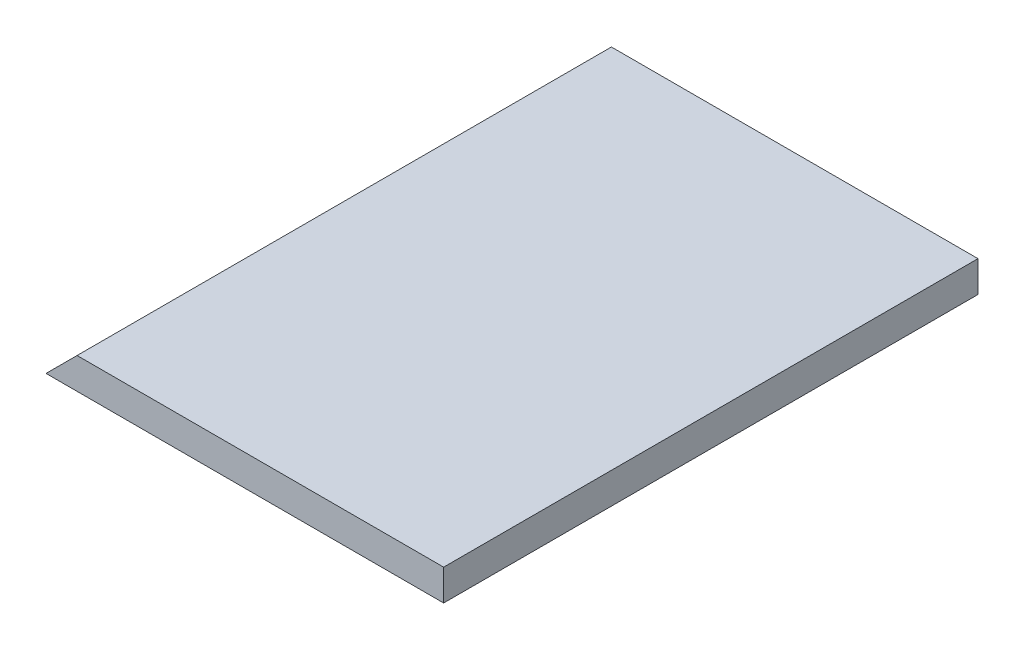
ISO-10303-21;
HEADER;
FILE_DESCRIPTION(('STEP AP214'),'2;1');
FILE_NAME('part.step','',(''),(''),'','','');
FILE_SCHEMA(('AUTOMOTIVE_DESIGN { 1 0 10303 214 1 1 1 1 }'));
ENDSEC;
DATA;
#1=APPLICATION_CONTEXT('core data for automotive mechanical design processes');
#2=APPLICATION_PROTOCOL_DEFINITION('international standard','automotive_design',2000,#1);
#3=PRODUCT_CONTEXT('',#1,'mechanical');
#4=PRODUCT('Part','Part','',(#3));
#5=PRODUCT_RELATED_PRODUCT_CATEGORY('part','',(#4));
#6=PRODUCT_DEFINITION_FORMATION('','',#4);
#7=PRODUCT_DEFINITION_CONTEXT('part definition',#1,'design');
#8=PRODUCT_DEFINITION('design','',#6,#7);
#9=PRODUCT_DEFINITION_SHAPE('','',#8);
#10=(LENGTH_UNIT() NAMED_UNIT(*) SI_UNIT(.MILLI.,.METRE.));
#11=(NAMED_UNIT(*) PLANE_ANGLE_UNIT() SI_UNIT($,.RADIAN.));
#12=(NAMED_UNIT(*) SI_UNIT($,.STERADIAN.) SOLID_ANGLE_UNIT());
#13=UNCERTAINTY_MEASURE_WITH_UNIT(LENGTH_MEASURE(1.E-05),#10,'distance_accuracy_value','');
#14=(GEOMETRIC_REPRESENTATION_CONTEXT(3) GLOBAL_UNCERTAINTY_ASSIGNED_CONTEXT((#13)) GLOBAL_UNIT_ASSIGNED_CONTEXT((#10,
#11,#12)) REPRESENTATION_CONTEXT('',''));
#15=CARTESIAN_POINT('',(0.,0.,0.));
#16=DIRECTION('',(0.,0.,1.));
#17=DIRECTION('',(1.,0.,0.));
#18=AXIS2_PLACEMENT_3D('',#15,#16,#17);
#19=CARTESIAN_POINT('',(0.,0.635,0.));
#20=DIRECTION('',(0.,0.,-1.));
#21=DIRECTION('',(-1.,0.,0.));
#22=AXIS2_PLACEMENT_3D('',#19,#20,#21);
#23=PLANE('',#22);
#24=DIRECTION('',(1.,0.,0.));
#25=VECTOR('',#24,1.);
#26=CARTESIAN_POINT('',(0.,0.635,0.));
#27=LINE('',#26,#25);
#28=CARTESIAN_POINT('',(0.635,0.635,0.));
#29=VERTEX_POINT('',#28);
#30=CARTESIAN_POINT('',(8.128,0.635,0.));
#31=VERTEX_POINT('',#30);
#32=EDGE_CURVE('E72',#29,#31,#27,.T.);
#33=ORIENTED_EDGE('',*,*,#32,.F.);
#34=DIRECTION('',(0.707106781186547,0.707106781186548,0.));
#35=VECTOR('',#34,1.);
#36=CARTESIAN_POINT('',(0.635,0.635,0.));
#37=LINE('',#36,#35);
#38=CARTESIAN_POINT('',(0.,0.,0.));
#39=VERTEX_POINT('',#38);
#40=EDGE_CURVE('E41',#29,#39,#37,.F.);
#41=ORIENTED_EDGE('',*,*,#40,.T.);
#42=DIRECTION('',(1.,0.,0.));
#43=VECTOR('',#42,1.);
#44=CARTESIAN_POINT('',(0.,0.,0.));
#45=LINE('',#44,#43);
#46=CARTESIAN_POINT('',(8.128,0.,0.));
#47=VERTEX_POINT('',#46);
#48=EDGE_CURVE('E85',#39,#47,#45,.T.);
#49=ORIENTED_EDGE('',*,*,#48,.T.);
#50=DIRECTION('',(0.,-1.,0.));
#51=VECTOR('',#50,1.);
#52=CARTESIAN_POINT('',(8.128,0.635,0.));
#53=LINE('',#52,#51);
#54=EDGE_CURVE('E83',#31,#47,#53,.T.);
#55=ORIENTED_EDGE('',*,*,#54,.F.);
#56=EDGE_LOOP('',(#33,#41,#49,#55));
#57=FACE_BOUND('',#56,.T.);
#58=ADVANCED_FACE('F33',(#57),#23,.F.);
#59=CARTESIAN_POINT('',(8.128,0.635,0.));
#60=DIRECTION('',(-1.,0.,0.));
#61=DIRECTION('',(0.,0.,1.));
#62=AXIS2_PLACEMENT_3D('',#59,#60,#61);
#63=PLANE('',#62);
#64=DIRECTION('',(0.,0.,-1.));
#65=VECTOR('',#64,1.);
#66=CARTESIAN_POINT('',(8.128,0.,0.));
#67=LINE('',#66,#65);
#68=CARTESIAN_POINT('',(8.128,0.,-10.922));
#69=VERTEX_POINT('',#68);
#70=EDGE_CURVE('E99',#47,#69,#67,.T.);
#71=ORIENTED_EDGE('',*,*,#70,.T.);
#72=DIRECTION('',(0.,-1.,0.));
#73=VECTOR('',#72,1.);
#74=CARTESIAN_POINT('',(8.128,0.635,-10.922));
#75=LINE('',#74,#73);
#76=CARTESIAN_POINT('',(8.128,0.635,-10.922));
#77=VERTEX_POINT('',#76);
#78=EDGE_CURVE('E88',#77,#69,#75,.T.);
#79=ORIENTED_EDGE('',*,*,#78,.F.);
#80=DIRECTION('',(0.,0.,-1.));
#81=VECTOR('',#80,1.);
#82=CARTESIAN_POINT('',(8.128,0.635,0.));
#83=LINE('',#82,#81);
#84=EDGE_CURVE('E76',#31,#77,#83,.T.);
#85=ORIENTED_EDGE('',*,*,#84,.F.);
#86=ORIENTED_EDGE('',*,*,#54,.T.);
#87=EDGE_LOOP('',(#71,#79,#85,#86));
#88=FACE_BOUND('',#87,.T.);
#89=ADVANCED_FACE('F90',(#88),#63,.F.);
#90=CARTESIAN_POINT('',(0.,0.635,-10.922));
#91=DIRECTION('',(0.,0.,1.));
#92=DIRECTION('',(1.,0.,0.));
#93=AXIS2_PLACEMENT_3D('',#90,#91,#92);
#94=PLANE('',#93);
#95=DIRECTION('',(-1.,0.,0.));
#96=VECTOR('',#95,1.);
#97=CARTESIAN_POINT('',(0.,0.,-10.922));
#98=LINE('',#97,#96);
#99=CARTESIAN_POINT('',(0.,0.,-10.922));
#100=VERTEX_POINT('',#99);
#101=EDGE_CURVE('E80',#69,#100,#98,.T.);
#102=ORIENTED_EDGE('',*,*,#101,.T.);
#103=DIRECTION('',(-0.707106781186547,-0.707106781186548,0.));
#104=VECTOR('',#103,1.);
#105=CARTESIAN_POINT('',(0.635,0.635,-10.922));
#106=LINE('',#105,#104);
#107=CARTESIAN_POINT('',(0.635,0.635,-10.922));
#108=VERTEX_POINT('',#107);
#109=EDGE_CURVE('E11',#100,#108,#106,.F.);
#110=ORIENTED_EDGE('',*,*,#109,.T.);
#111=DIRECTION('',(-1.,0.,0.));
#112=VECTOR('',#111,1.);
#113=CARTESIAN_POINT('',(0.,0.635,-10.922));
#114=LINE('',#113,#112);
#115=EDGE_CURVE('E92',#77,#108,#114,.T.);
#116=ORIENTED_EDGE('',*,*,#115,.F.);
#117=ORIENTED_EDGE('',*,*,#78,.T.);
#118=EDGE_LOOP('',(#102,#110,#116,#117));
#119=FACE_BOUND('',#118,.T.);
#120=ADVANCED_FACE('F116',(#119),#94,.F.);
#121=CARTESIAN_POINT('',(0.,0.635,0.));
#122=DIRECTION('',(0.,-1.,0.));
#123=DIRECTION('',(0.,0.,-1.));
#124=AXIS2_PLACEMENT_3D('',#121,#122,#123);
#125=PLANE('',#124);
#126=ORIENTED_EDGE('',*,*,#115,.T.);
#127=DIRECTION('',(0.,0.,1.));
#128=VECTOR('',#127,1.);
#129=CARTESIAN_POINT('',(0.635,0.635,0.));
#130=LINE('',#129,#128);
#131=EDGE_CURVE('E78',#108,#29,#130,.T.);
#132=ORIENTED_EDGE('',*,*,#131,.T.);
#133=ORIENTED_EDGE('',*,*,#32,.T.);
#134=ORIENTED_EDGE('',*,*,#84,.T.);
#135=EDGE_LOOP('',(#126,#132,#133,#134));
#136=FACE_BOUND('',#135,.T.);
#137=ADVANCED_FACE('F74',(#136),#125,.F.);
#138=CARTESIAN_POINT('',(0.,0.,0.));
#139=DIRECTION('',(0.,-1.,0.));
#140=DIRECTION('',(0.,0.,-1.));
#141=AXIS2_PLACEMENT_3D('',#138,#139,#140);
#142=PLANE('',#141);
#143=DIRECTION('',(0.,0.,1.));
#144=VECTOR('',#143,1.);
#145=CARTESIAN_POINT('',(0.,0.,0.));
#146=LINE('',#145,#144);
#147=EDGE_CURVE('E96',#100,#39,#146,.T.);
#148=ORIENTED_EDGE('',*,*,#147,.F.);
#149=ORIENTED_EDGE('',*,*,#101,.F.);
#150=ORIENTED_EDGE('',*,*,#70,.F.);
#151=ORIENTED_EDGE('',*,*,#48,.F.);
#152=EDGE_LOOP('',(#148,#149,#150,#151));
#153=FACE_BOUND('',#152,.T.);
#154=ADVANCED_FACE('F105',(#153),#142,.T.);
#155=CARTESIAN_POINT('',(0.635,0.635,0.));
#156=DIRECTION('',(0.707106781186548,-0.707106781186547,0.));
#157=DIRECTION('',(0.,0.,1.));
#158=AXIS2_PLACEMENT_3D('',#155,#156,#157);
#159=PLANE('',#158);
#160=ORIENTED_EDGE('',*,*,#109,.F.);
#161=ORIENTED_EDGE('',*,*,#147,.T.);
#162=ORIENTED_EDGE('',*,*,#40,.F.);
#163=ORIENTED_EDGE('',*,*,#131,.F.);
#164=EDGE_LOOP('',(#160,#161,#162,#163));
#165=FACE_BOUND('',#164,.T.);
#166=ADVANCED_FACE('F35',(#165),#159,.F.);
#167=CLOSED_SHELL('',(#58,#89,#120,#137,#154,#166));
#168=MANIFOLD_SOLID_BREP('B2',#167);
#169=ADVANCED_BREP_SHAPE_REPRESENTATION('',(#18,#168),#14);
#170=SHAPE_DEFINITION_REPRESENTATION(#9,#169);
ENDSEC;
END-ISO-10303-21;
